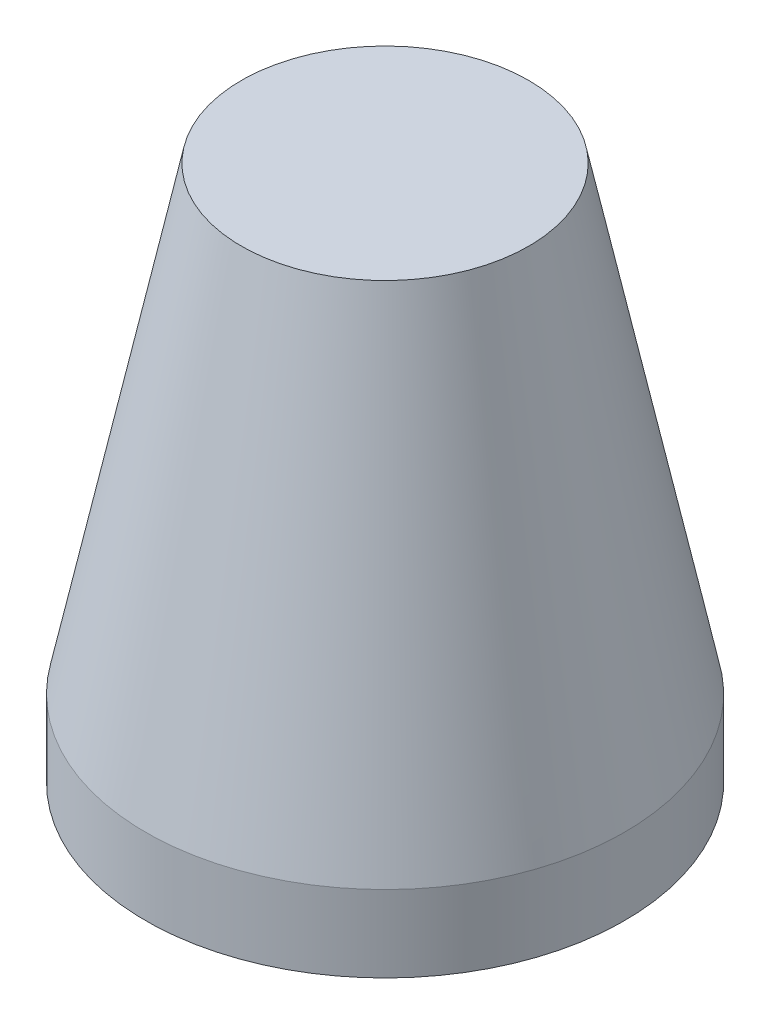
ISO-10303-21;
HEADER;
FILE_DESCRIPTION(('STEP AP214'),'2;1');
FILE_NAME('part.step','',(''),(''),'','','');
FILE_SCHEMA(('AUTOMOTIVE_DESIGN { 1 0 10303 214 1 1 1 1 }'));
ENDSEC;
DATA;
#1=APPLICATION_CONTEXT('core data for automotive mechanical design processes');
#2=APPLICATION_PROTOCOL_DEFINITION('international standard','automotive_design',2000,#1);
#3=PRODUCT_CONTEXT('',#1,'mechanical');
#4=PRODUCT('Part','Part','',(#3));
#5=PRODUCT_RELATED_PRODUCT_CATEGORY('part','',(#4));
#6=PRODUCT_DEFINITION_FORMATION('','',#4);
#7=PRODUCT_DEFINITION_CONTEXT('part definition',#1,'design');
#8=PRODUCT_DEFINITION('design','',#6,#7);
#9=PRODUCT_DEFINITION_SHAPE('','',#8);
#10=(LENGTH_UNIT() NAMED_UNIT(*) SI_UNIT(.MILLI.,.METRE.));
#11=(NAMED_UNIT(*) PLANE_ANGLE_UNIT() SI_UNIT($,.RADIAN.));
#12=(NAMED_UNIT(*) SI_UNIT($,.STERADIAN.) SOLID_ANGLE_UNIT());
#13=UNCERTAINTY_MEASURE_WITH_UNIT(LENGTH_MEASURE(1.E-05),#10,'distance_accuracy_value','');
#14=(GEOMETRIC_REPRESENTATION_CONTEXT(3) GLOBAL_UNCERTAINTY_ASSIGNED_CONTEXT((#13)) GLOBAL_UNIT_ASSIGNED_CONTEXT((#10,
#11,#12)) REPRESENTATION_CONTEXT('',''));
#15=CARTESIAN_POINT('',(0.,0.,0.));
#16=DIRECTION('',(0.,0.,1.));
#17=DIRECTION('',(1.,0.,0.));
#18=AXIS2_PLACEMENT_3D('',#15,#16,#17);
#19=CARTESIAN_POINT('',(0.,40.,0.));
#20=DIRECTION('',(0.,-1.,0.));
#21=DIRECTION('',(0.,0.,-1.));
#22=AXIS2_PLACEMENT_3D('',#19,#20,#21);
#23=PLANE('',#22);
#24=CARTESIAN_POINT('',(0.,40.,0.));
#25=DIRECTION('',(0.,-1.,0.));
#26=DIRECTION('',(0.,0.,-1.));
#27=AXIS2_PLACEMENT_3D('',#24,#25,#26);
#28=CIRCLE('',#27,15.);
#29=CARTESIAN_POINT('',(0.,40.,-15.));
#30=VERTEX_POINT('',#29);
#31=EDGE_CURVE('E10',#30,#30,#28,.T.);
#32=ORIENTED_EDGE('',*,*,#31,.F.);
#33=EDGE_LOOP('',(#32));
#34=FACE_BOUND('',#33,.T.);
#35=ADVANCED_FACE('F36',(#34),#23,.F.);
#36=CARTESIAN_POINT('',(0.,40.,0.));
#37=DIRECTION('',(0.,-1.,0.));
#38=DIRECTION('',(0.,0.,-1.));
#39=AXIS2_PLACEMENT_3D('',#36,#37,#38);
#40=CONICAL_SURFACE('',#39,15.,0.205395389189767);
#41=CARTESIAN_POINT('',(0.,-8.,0.));
#42=DIRECTION('',(0.,-1.,0.));
#43=DIRECTION('',(0.,0.,-1.));
#44=AXIS2_PLACEMENT_3D('',#41,#42,#43);
#45=CIRCLE('',#44,25.);
#46=CARTESIAN_POINT('',(0.,-8.,-25.));
#47=VERTEX_POINT('',#46);
#48=EDGE_CURVE('E42',#47,#47,#45,.T.);
#49=ORIENTED_EDGE('',*,*,#48,.F.);
#50=EDGE_LOOP('',(#49));
#51=FACE_BOUND('',#50,.T.);
#52=ORIENTED_EDGE('',*,*,#31,.T.);
#53=EDGE_LOOP('',(#52));
#54=FACE_BOUND('',#53,.T.);
#55=ADVANCED_FACE('F57',(#51,#54),#40,.T.);
#56=CARTESIAN_POINT('',(0.,0.,0.));
#57=DIRECTION('',(0.,-1.,0.));
#58=DIRECTION('',(0.,0.,-1.));
#59=AXIS2_PLACEMENT_3D('',#56,#57,#58);
#60=CYLINDRICAL_SURFACE('',#59,25.);
#61=CARTESIAN_POINT('',(0.,-16.,0.));
#62=DIRECTION('',(0.,-1.,0.));
#63=DIRECTION('',(0.,0.,-1.));
#64=AXIS2_PLACEMENT_3D('',#61,#62,#63);
#65=CIRCLE('',#64,25.);
#66=CARTESIAN_POINT('',(0.,-16.,-25.));
#67=VERTEX_POINT('',#66);
#68=EDGE_CURVE('E46',#67,#67,#65,.T.);
#69=ORIENTED_EDGE('',*,*,#68,.F.);
#70=EDGE_LOOP('',(#69));
#71=FACE_BOUND('',#70,.T.);
#72=ORIENTED_EDGE('',*,*,#48,.T.);
#73=EDGE_LOOP('',(#72));
#74=FACE_BOUND('',#73,.T.);
#75=ADVANCED_FACE('F55',(#71,#74),#60,.T.);
#76=CARTESIAN_POINT('',(-25.,-16.,0.));
#77=DIRECTION('',(0.,1.,0.));
#78=DIRECTION('',(0.,0.,1.));
#79=AXIS2_PLACEMENT_3D('',#76,#77,#78);
#80=PLANE('',#79);
#81=ORIENTED_EDGE('',*,*,#68,.T.);
#82=EDGE_LOOP('',(#81));
#83=FACE_BOUND('',#82,.T.);
#84=ADVANCED_FACE('F53',(#83),#80,.F.);
#85=CLOSED_SHELL('',(#35,#55,#75,#84));
#86=MANIFOLD_SOLID_BREP('B2',#85);
#87=ADVANCED_BREP_SHAPE_REPRESENTATION('',(#18,#86),#14);
#88=SHAPE_DEFINITION_REPRESENTATION(#9,#87);
ENDSEC;
END-ISO-10303-21;
